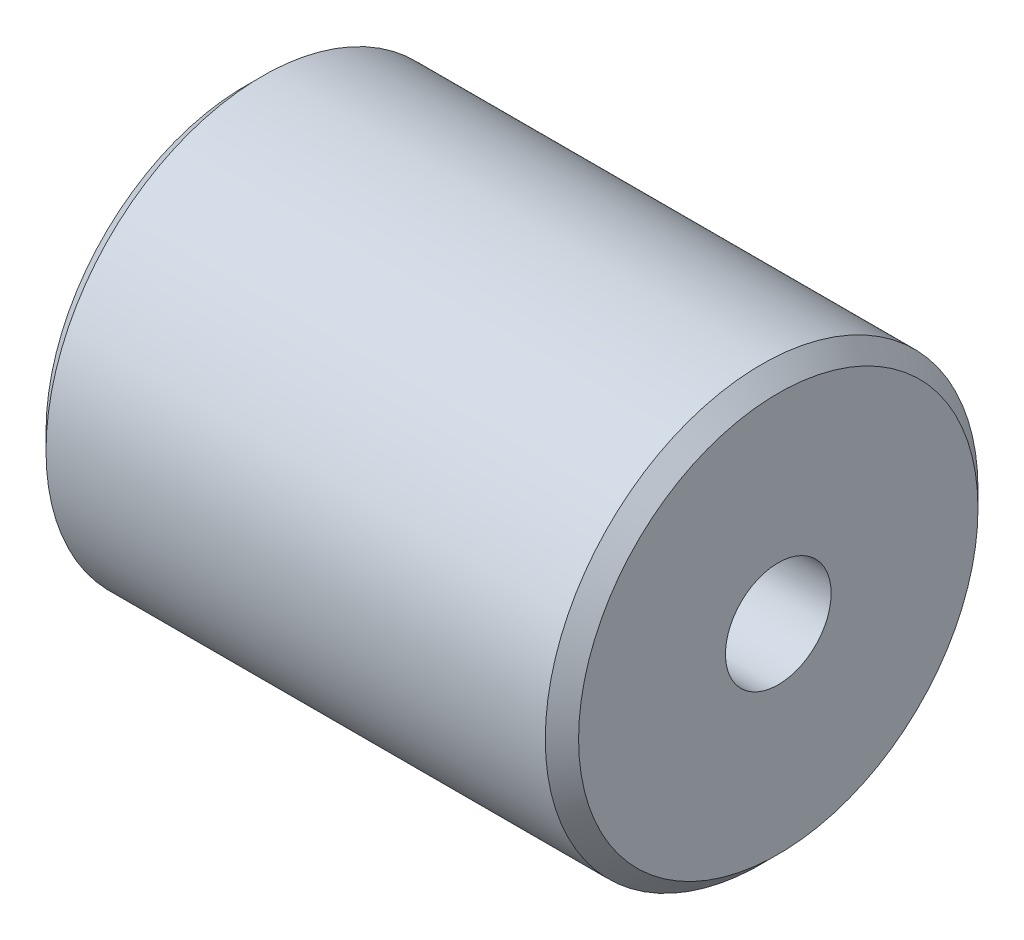
ISO-10303-21;
HEADER;
FILE_DESCRIPTION(('STEP AP214'),'2;1');
FILE_NAME('part.step','',(''),(''),'','','');
FILE_SCHEMA(('AUTOMOTIVE_DESIGN { 1 0 10303 214 1 1 1 1 }'));
ENDSEC;
DATA;
#1=APPLICATION_CONTEXT('core data for automotive mechanical design processes');
#2=APPLICATION_PROTOCOL_DEFINITION('international standard','automotive_design',2000,#1);
#3=PRODUCT_CONTEXT('',#1,'mechanical');
#4=PRODUCT('Part','Part','',(#3));
#5=PRODUCT_RELATED_PRODUCT_CATEGORY('part','',(#4));
#6=PRODUCT_DEFINITION_FORMATION('','',#4);
#7=PRODUCT_DEFINITION_CONTEXT('part definition',#1,'design');
#8=PRODUCT_DEFINITION('design','',#6,#7);
#9=PRODUCT_DEFINITION_SHAPE('','',#8);
#10=(LENGTH_UNIT() NAMED_UNIT(*) SI_UNIT(.MILLI.,.METRE.));
#11=(NAMED_UNIT(*) PLANE_ANGLE_UNIT() SI_UNIT($,.RADIAN.));
#12=(NAMED_UNIT(*) SI_UNIT($,.STERADIAN.) SOLID_ANGLE_UNIT());
#13=UNCERTAINTY_MEASURE_WITH_UNIT(LENGTH_MEASURE(1.E-05),#10,'distance_accuracy_value','');
#14=(GEOMETRIC_REPRESENTATION_CONTEXT(3) GLOBAL_UNCERTAINTY_ASSIGNED_CONTEXT((#13)) GLOBAL_UNIT_ASSIGNED_CONTEXT((#10,
#11,#12)) REPRESENTATION_CONTEXT('',''));
#15=CARTESIAN_POINT('',(0.,0.,0.));
#16=DIRECTION('',(0.,0.,1.));
#17=DIRECTION('',(1.,0.,0.));
#18=AXIS2_PLACEMENT_3D('',#15,#16,#17);
#19=CARTESIAN_POINT('',(0.,0.,0.));
#20=DIRECTION('',(1.,0.,0.));
#21=DIRECTION('',(0.,0.,-1.));
#22=AXIS2_PLACEMENT_3D('',#19,#20,#21);
#23=CYLINDRICAL_SURFACE('',#22,3.175);
#24=CARTESIAN_POINT('',(32.,0.,0.));
#25=DIRECTION('',(1.,0.,0.));
#26=DIRECTION('',(0.,0.,-1.));
#27=AXIS2_PLACEMENT_3D('',#24,#25,#26);
#28=CIRCLE('',#27,3.175);
#29=CARTESIAN_POINT('',(32.,0.,-3.175));
#30=VERTEX_POINT('',#29);
#31=EDGE_CURVE('E67',#30,#30,#28,.T.);
#32=ORIENTED_EDGE('',*,*,#31,.T.);
#33=EDGE_LOOP('',(#32));
#34=FACE_BOUND('',#33,.T.);
#35=CARTESIAN_POINT('',(20.,0.,0.));
#36=DIRECTION('',(-1.,0.,0.));
#37=DIRECTION('',(0.,0.,1.));
#38=AXIS2_PLACEMENT_3D('',#35,#36,#37);
#39=CIRCLE('',#38,3.175);
#40=CARTESIAN_POINT('',(20.,0.,3.175));
#41=VERTEX_POINT('',#40);
#42=EDGE_CURVE('E68',#41,#41,#39,.F.);
#43=ORIENTED_EDGE('',*,*,#42,.F.);
#44=EDGE_LOOP('',(#43));
#45=FACE_BOUND('',#44,.T.);
#46=ADVANCED_FACE('F42',(#34,#45),#23,.F.);
#47=CARTESIAN_POINT('',(32.,0.,0.));
#48=DIRECTION('',(-1.,0.,0.));
#49=DIRECTION('',(0.,0.,1.));
#50=AXIS2_PLACEMENT_3D('',#47,#48,#49);
#51=CYLINDRICAL_SURFACE('',#50,13.);
#52=CARTESIAN_POINT('',(31.,0.,0.));
#53=DIRECTION('',(1.,0.,0.));
#54=DIRECTION('',(0.,0.,-1.));
#55=AXIS2_PLACEMENT_3D('',#52,#53,#54);
#56=CIRCLE('',#55,13.);
#57=CARTESIAN_POINT('',(31.,0.,-13.));
#58=VERTEX_POINT('',#57);
#59=EDGE_CURVE('E51',#58,#58,#56,.F.);
#60=ORIENTED_EDGE('',*,*,#59,.T.);
#61=EDGE_LOOP('',(#60));
#62=FACE_BOUND('',#61,.T.);
#63=CARTESIAN_POINT('',(1.00000000000001,0.,0.));
#64=DIRECTION('',(1.,0.,0.));
#65=DIRECTION('',(0.,0.,-1.));
#66=AXIS2_PLACEMENT_3D('',#63,#64,#65);
#67=CIRCLE('',#66,13.);
#68=CARTESIAN_POINT('',(1.00000000000001,0.,-13.));
#69=VERTEX_POINT('',#68);
#70=EDGE_CURVE('E56',#69,#69,#67,.T.);
#71=ORIENTED_EDGE('',*,*,#70,.T.);
#72=EDGE_LOOP('',(#71));
#73=FACE_BOUND('',#72,.T.);
#74=ADVANCED_FACE('F103',(#62,#73),#51,.T.);
#75=CARTESIAN_POINT('',(32.,0.,0.));
#76=DIRECTION('',(1.,0.,0.));
#77=DIRECTION('',(0.,0.,-1.));
#78=AXIS2_PLACEMENT_3D('',#75,#76,#77);
#79=PLANE('',#78);
#80=CARTESIAN_POINT('',(32.,0.,0.));
#81=DIRECTION('',(1.,0.,0.));
#82=DIRECTION('',(0.,0.,-1.));
#83=AXIS2_PLACEMENT_3D('',#80,#81,#82);
#84=CIRCLE('',#83,12.);
#85=CARTESIAN_POINT('',(32.,0.,-12.));
#86=VERTEX_POINT('',#85);
#87=EDGE_CURVE('E61',#86,#86,#84,.T.);
#88=ORIENTED_EDGE('',*,*,#87,.T.);
#89=EDGE_LOOP('',(#88));
#90=FACE_BOUND('',#89,.T.);
#91=ORIENTED_EDGE('',*,*,#31,.F.);
#92=EDGE_LOOP('',(#91));
#93=FACE_BOUND('',#92,.T.);
#94=ADVANCED_FACE('F96',(#90,#93),#79,.T.);
#95=CARTESIAN_POINT('',(0.,0.,0.));
#96=DIRECTION('',(1.,0.,0.));
#97=DIRECTION('',(0.,0.,-1.));
#98=AXIS2_PLACEMENT_3D('',#95,#96,#97);
#99=PLANE('',#98);
#100=CARTESIAN_POINT('',(0.,0.,0.));
#101=DIRECTION('',(1.,0.,0.));
#102=DIRECTION('',(0.,0.,-1.));
#103=AXIS2_PLACEMENT_3D('',#100,#101,#102);
#104=CIRCLE('',#103,12.);
#105=CARTESIAN_POINT('',(0.,0.,-12.));
#106=VERTEX_POINT('',#105);
#107=EDGE_CURVE('E10',#106,#106,#104,.F.);
#108=ORIENTED_EDGE('',*,*,#107,.T.);
#109=EDGE_LOOP('',(#108));
#110=FACE_BOUND('',#109,.T.);
#111=CARTESIAN_POINT('',(0.,0.,0.));
#112=DIRECTION('',(-1.,0.,0.));
#113=DIRECTION('',(0.,0.,1.));
#114=AXIS2_PLACEMENT_3D('',#111,#112,#113);
#115=CIRCLE('',#114,5.);
#116=CARTESIAN_POINT('',(0.,0.,5.));
#117=VERTEX_POINT('',#116);
#118=EDGE_CURVE('E76',#117,#117,#115,.T.);
#119=ORIENTED_EDGE('',*,*,#118,.F.);
#120=EDGE_LOOP('',(#119));
#121=FACE_BOUND('',#120,.T.);
#122=ADVANCED_FACE('F94',(#110,#121),#99,.F.);
#123=CARTESIAN_POINT('',(20.,0.,0.));
#124=DIRECTION('',(-1.,0.,0.));
#125=DIRECTION('',(0.,0.,1.));
#126=AXIS2_PLACEMENT_3D('',#123,#124,#125);
#127=PLANE('',#126);
#128=CARTESIAN_POINT('',(20.,0.,0.));
#129=DIRECTION('',(-1.,0.,0.));
#130=DIRECTION('',(0.,0.,1.));
#131=AXIS2_PLACEMENT_3D('',#128,#129,#130);
#132=CIRCLE('',#131,5.);
#133=CARTESIAN_POINT('',(20.,0.,5.));
#134=VERTEX_POINT('',#133);
#135=EDGE_CURVE('E72',#134,#134,#132,.T.);
#136=ORIENTED_EDGE('',*,*,#135,.T.);
#137=EDGE_LOOP('',(#136));
#138=FACE_BOUND('',#137,.T.);
#139=ORIENTED_EDGE('',*,*,#42,.T.);
#140=EDGE_LOOP('',(#139));
#141=FACE_BOUND('',#140,.T.);
#142=ADVANCED_FACE('F84',(#138,#141),#127,.T.);
#143=CARTESIAN_POINT('',(20.,0.,0.));
#144=DIRECTION('',(-1.,0.,0.));
#145=DIRECTION('',(0.,0.,1.));
#146=AXIS2_PLACEMENT_3D('',#143,#144,#145);
#147=CYLINDRICAL_SURFACE('',#146,5.);
#148=ORIENTED_EDGE('',*,*,#135,.F.);
#149=EDGE_LOOP('',(#148));
#150=FACE_BOUND('',#149,.T.);
#151=ORIENTED_EDGE('',*,*,#118,.T.);
#152=EDGE_LOOP('',(#151));
#153=FACE_BOUND('',#152,.T.);
#154=ADVANCED_FACE('F87',(#150,#153),#147,.F.);
#155=CARTESIAN_POINT('',(32.,0.,0.));
#156=DIRECTION('',(-1.,0.,0.));
#157=DIRECTION('',(0.,0.,1.));
#158=AXIS2_PLACEMENT_3D('',#155,#156,#157);
#159=CONICAL_SURFACE('',#158,12.,0.785398163397447);
#160=ORIENTED_EDGE('',*,*,#59,.F.);
#161=EDGE_LOOP('',(#160));
#162=FACE_BOUND('',#161,.T.);
#163=ORIENTED_EDGE('',*,*,#87,.F.);
#164=EDGE_LOOP('',(#163));
#165=FACE_BOUND('',#164,.T.);
#166=ADVANCED_FACE('F90',(#162,#165),#159,.T.);
#167=CARTESIAN_POINT('',(1.00000000000001,0.,0.));
#168=DIRECTION('',(1.,0.,0.));
#169=DIRECTION('',(0.,0.,-1.));
#170=AXIS2_PLACEMENT_3D('',#167,#168,#169);
#171=CONICAL_SURFACE('',#170,13.,0.785398163397448);
#172=ORIENTED_EDGE('',*,*,#107,.F.);
#173=EDGE_LOOP('',(#172));
#174=FACE_BOUND('',#173,.T.);
#175=ORIENTED_EDGE('',*,*,#70,.F.);
#176=EDGE_LOOP('',(#175));
#177=FACE_BOUND('',#176,.T.);
#178=ADVANCED_FACE('F45',(#174,#177),#171,.T.);
#179=CLOSED_SHELL('',(#46,#74,#94,#122,#142,#154,#166,#178));
#180=MANIFOLD_SOLID_BREP('B2',#179);
#181=ADVANCED_BREP_SHAPE_REPRESENTATION('',(#18,#180),#14);
#182=SHAPE_DEFINITION_REPRESENTATION(#9,#181);
ENDSEC;
END-ISO-10303-21;
